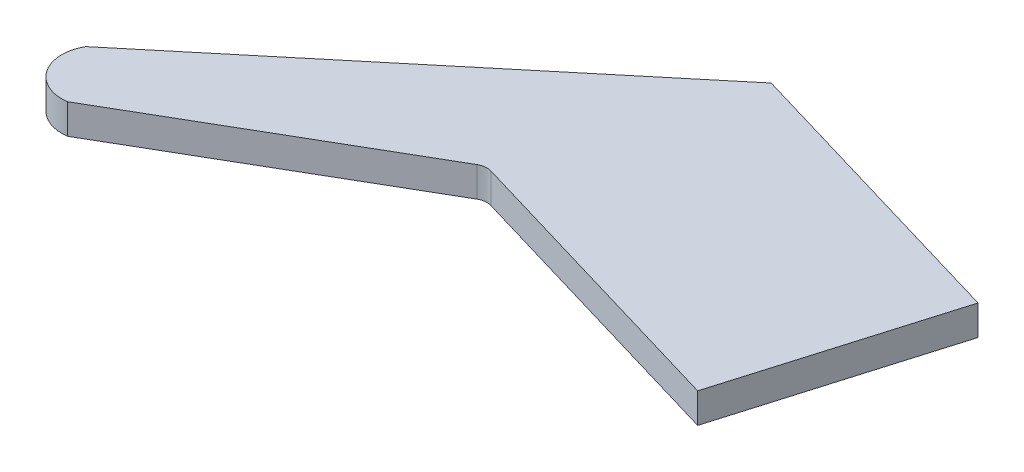
ISO-10303-21;
HEADER;
FILE_DESCRIPTION(('STEP AP214'),'2;1');
FILE_NAME('part.step','',(''),(''),'','','');
FILE_SCHEMA(('AUTOMOTIVE_DESIGN { 1 0 10303 214 1 1 1 1 }'));
ENDSEC;
DATA;
#1=APPLICATION_CONTEXT('core data for automotive mechanical design processes');
#2=APPLICATION_PROTOCOL_DEFINITION('international standard','automotive_design',2000,#1);
#3=PRODUCT_CONTEXT('',#1,'mechanical');
#4=PRODUCT('Part','Part','',(#3));
#5=PRODUCT_RELATED_PRODUCT_CATEGORY('part','',(#4));
#6=PRODUCT_DEFINITION_FORMATION('','',#4);
#7=PRODUCT_DEFINITION_CONTEXT('part definition',#1,'design');
#8=PRODUCT_DEFINITION('design','',#6,#7);
#9=PRODUCT_DEFINITION_SHAPE('','',#8);
#10=(LENGTH_UNIT() NAMED_UNIT(*) SI_UNIT(.MILLI.,.METRE.));
#11=(NAMED_UNIT(*) PLANE_ANGLE_UNIT() SI_UNIT($,.RADIAN.));
#12=(NAMED_UNIT(*) SI_UNIT($,.STERADIAN.) SOLID_ANGLE_UNIT());
#13=UNCERTAINTY_MEASURE_WITH_UNIT(LENGTH_MEASURE(1.E-05),#10,'distance_accuracy_value','');
#14=(GEOMETRIC_REPRESENTATION_CONTEXT(3) GLOBAL_UNCERTAINTY_ASSIGNED_CONTEXT((#13)) GLOBAL_UNIT_ASSIGNED_CONTEXT((#10,
#11,#12)) REPRESENTATION_CONTEXT('',''));
#15=CARTESIAN_POINT('',(0.,0.,0.));
#16=DIRECTION('',(0.,0.,1.));
#17=DIRECTION('',(1.,0.,0.));
#18=AXIS2_PLACEMENT_3D('',#15,#16,#17);
#19=CARTESIAN_POINT('',(24.2687822482393,4.7625,33.7222913548281));
#20=DIRECTION('',(0.,-1.,0.));
#21=DIRECTION('',(0.,0.,-1.));
#22=AXIS2_PLACEMENT_3D('',#19,#20,#21);
#23=CYLINDRICAL_SURFACE('',#22,2.54);
#24=CARTESIAN_POINT('',(24.2687822482393,0.,33.7222913548281));
#25=DIRECTION('',(0.,-1.,0.));
#26=DIRECTION('',(0.,0.,-1.));
#27=AXIS2_PLACEMENT_3D('',#24,#25,#26);
#28=CIRCLE('',#27,2.54);
#29=CARTESIAN_POINT('',(22.9946247329012,0.,31.5249924161065));
#30=VERTEX_POINT('',#29);
#31=CARTESIAN_POINT('',(24.9901812237873,0.,31.2868892282629));
#32=VERTEX_POINT('',#31);
#33=EDGE_CURVE('E138',#30,#32,#28,.T.);
#34=ORIENTED_EDGE('',*,*,#33,.T.);
#35=DIRECTION('',(0.,-1.,0.));
#36=VECTOR('',#35,1.);
#37=CARTESIAN_POINT('',(24.9901812237873,4.7625,31.2868892282629));
#38=LINE('',#37,#36);
#39=CARTESIAN_POINT('',(24.9901812237873,4.7625,31.2868892282629));
#40=VERTEX_POINT('',#39);
#41=EDGE_CURVE('E11',#40,#32,#38,.T.);
#42=ORIENTED_EDGE('',*,*,#41,.F.);
#43=CARTESIAN_POINT('',(24.2687822482393,4.7625,33.7222913548281));
#44=DIRECTION('',(0.,-1.,0.));
#45=DIRECTION('',(0.,0.,-1.));
#46=AXIS2_PLACEMENT_3D('',#43,#44,#45);
#47=CIRCLE('',#46,2.54);
#48=CARTESIAN_POINT('',(22.9946247329012,4.7625,31.5249924161065));
#49=VERTEX_POINT('',#48);
#50=EDGE_CURVE('E157',#49,#40,#47,.T.);
#51=ORIENTED_EDGE('',*,*,#50,.F.);
#52=DIRECTION('',(0.,-1.,0.));
#53=VECTOR('',#52,1.);
#54=CARTESIAN_POINT('',(22.9946247329012,4.7625,31.5249924161065));
#55=LINE('',#54,#53);
#56=EDGE_CURVE('E134',#49,#30,#55,.T.);
#57=ORIENTED_EDGE('',*,*,#56,.T.);
#58=EDGE_LOOP('',(#34,#42,#51,#57));
#59=FACE_BOUND('',#58,.T.);
#60=ADVANCED_FACE('F43',(#59),#23,.F.);
#61=CARTESIAN_POINT('',(71.7331323202995,4.7625,45.1327821374025));
#62=DIRECTION('',(0.284015344703924,0.,-0.958819734868193));
#63=DIRECTION('',(-0.958819734868193,0.,-0.284015344703924));
#64=AXIS2_PLACEMENT_3D('',#61,#62,#63);
#65=PLANE('',#64);
#66=DIRECTION('',(0.958819734868193,0.,0.284015344703924));
#67=VECTOR('',#66,1.);
#68=CARTESIAN_POINT('',(71.7331323202995,0.,45.1327821374025));
#69=LINE('',#68,#67);
#70=CARTESIAN_POINT('',(71.7331323202995,0.,45.1327821374025));
#71=VERTEX_POINT('',#70);
#72=EDGE_CURVE('E142',#32,#71,#69,.T.);
#73=ORIENTED_EDGE('',*,*,#72,.T.);
#74=DIRECTION('',(0.,-1.,0.));
#75=VECTOR('',#74,1.);
#76=CARTESIAN_POINT('',(71.7331323202995,4.7625,45.1327821374025));
#77=LINE('',#76,#75);
#78=CARTESIAN_POINT('',(71.7331323202995,4.7625,45.1327821374025));
#79=VERTEX_POINT('',#78);
#80=EDGE_CURVE('E52',#79,#71,#77,.T.);
#81=ORIENTED_EDGE('',*,*,#80,.F.);
#82=DIRECTION('',(0.958819734868193,0.,0.284015344703924));
#83=VECTOR('',#82,1.);
#84=CARTESIAN_POINT('',(71.7331323202995,4.7625,45.1327821374025));
#85=LINE('',#84,#83);
#86=EDGE_CURVE('E100',#40,#79,#85,.T.);
#87=ORIENTED_EDGE('',*,*,#86,.F.);
#88=ORIENTED_EDGE('',*,*,#41,.T.);
#89=EDGE_LOOP('',(#73,#81,#87,#88));
#90=FACE_BOUND('',#89,.T.);
#91=ADVANCED_FACE('F191',(#90),#65,.F.);
#92=CARTESIAN_POINT('',(81.9228928499145,4.7625,10.7327270996689));
#93=DIRECTION('',(-0.958819734868193,0.,-0.284015344703923));
#94=DIRECTION('',(-0.284015344703923,0.,0.958819734868193));
#95=AXIS2_PLACEMENT_3D('',#92,#93,#94);
#96=PLANE('',#95);
#97=DIRECTION('',(0.284015344703923,0.,-0.958819734868193));
#98=VECTOR('',#97,1.);
#99=CARTESIAN_POINT('',(81.9228928499145,0.,10.7327270996689));
#100=LINE('',#99,#98);
#101=CARTESIAN_POINT('',(81.9228928499145,0.,10.7327270996689));
#102=VERTEX_POINT('',#101);
#103=EDGE_CURVE('E145',#71,#102,#100,.T.);
#104=ORIENTED_EDGE('',*,*,#103,.T.);
#105=DIRECTION('',(0.,-1.,0.));
#106=VECTOR('',#105,1.);
#107=CARTESIAN_POINT('',(81.9228928499145,4.7625,10.7327270996689));
#108=LINE('',#107,#106);
#109=CARTESIAN_POINT('',(81.9228928499145,4.7625,10.7327270996689));
#110=VERTEX_POINT('',#109);
#111=EDGE_CURVE('E164',#110,#102,#108,.T.);
#112=ORIENTED_EDGE('',*,*,#111,.F.);
#113=DIRECTION('',(0.284015344703923,0.,-0.958819734868193));
#114=VECTOR('',#113,1.);
#115=CARTESIAN_POINT('',(81.9228928499145,4.7625,10.7327270996689));
#116=LINE('',#115,#114);
#117=EDGE_CURVE('E174',#79,#110,#116,.T.);
#118=ORIENTED_EDGE('',*,*,#117,.F.);
#119=ORIENTED_EDGE('',*,*,#80,.T.);
#120=EDGE_LOOP('',(#104,#112,#118,#119));
#121=FACE_BOUND('',#120,.T.);
#122=ADVANCED_FACE('F172',(#121),#96,.F.);
#123=CARTESIAN_POINT('',(81.9228928499145,4.7625,10.7327270996689));
#124=DIRECTION('',(-0.284015344703924,0.,0.958819734868193));
#125=DIRECTION('',(0.958819734868193,0.,0.284015344703924));
#126=AXIS2_PLACEMENT_3D('',#123,#124,#125);
#127=PLANE('',#126);
#128=DIRECTION('',(-0.958819734868193,0.,-0.284015344703924));
#129=VECTOR('',#128,1.);
#130=CARTESIAN_POINT('',(81.9228928499145,0.,10.7327270996689));
#131=LINE('',#130,#129);
#132=CARTESIAN_POINT('',(35.1799417534023,0.,-3.11316580947066));
#133=VERTEX_POINT('',#132);
#134=EDGE_CURVE('E148',#102,#133,#131,.T.);
#135=ORIENTED_EDGE('',*,*,#134,.T.);
#136=DIRECTION('',(0.,-1.,0.));
#137=VECTOR('',#136,1.);
#138=CARTESIAN_POINT('',(35.1799417534023,4.7625,-3.11316580947066));
#139=LINE('',#138,#137);
#140=CARTESIAN_POINT('',(35.1799417534023,4.7625,-3.11316580947066));
#141=VERTEX_POINT('',#140);
#142=EDGE_CURVE('E127',#141,#133,#139,.T.);
#143=ORIENTED_EDGE('',*,*,#142,.F.);
#144=DIRECTION('',(-0.958819734868193,0.,-0.284015344703924));
#145=VECTOR('',#144,1.);
#146=CARTESIAN_POINT('',(81.9228928499145,4.7625,10.7327270996689));
#147=LINE('',#146,#145);
#148=EDGE_CURVE('E116',#110,#141,#147,.T.);
#149=ORIENTED_EDGE('',*,*,#148,.F.);
#150=ORIENTED_EDGE('',*,*,#111,.T.);
#151=EDGE_LOOP('',(#135,#143,#149,#150));
#152=FACE_BOUND('',#151,.T.);
#153=ADVANCED_FACE('F180',(#152),#127,.F.);
#154=CARTESIAN_POINT('',(35.1799417534023,4.7625,-3.11316580947066));
#155=DIRECTION('',(0.639283715997344,0.,0.768970955537742));
#156=DIRECTION('',(0.768970955537742,0.,-0.639283715997343));
#157=AXIS2_PLACEMENT_3D('',#154,#155,#156);
#158=PLANE('',#157);
#159=DIRECTION('',(-0.768970955537742,0.,0.639283715997343));
#160=VECTOR('',#159,1.);
#161=CARTESIAN_POINT('',(35.1799417534023,0.,-3.11316580947066));
#162=LINE('',#161,#160);
#163=CARTESIAN_POINT('',(-24.3515697934004,0.,46.3783340274317));
#164=VERTEX_POINT('',#163);
#165=EDGE_CURVE('E125',#133,#164,#162,.T.);
#166=ORIENTED_EDGE('',*,*,#165,.T.);
#167=DIRECTION('',(0.,-1.,0.));
#168=VECTOR('',#167,1.);
#169=CARTESIAN_POINT('',(-24.3515697934004,4.7625,46.3783340274317));
#170=LINE('',#169,#168);
#171=CARTESIAN_POINT('',(-24.3515697934004,4.7625,46.3783340274317));
#172=VERTEX_POINT('',#171);
#173=EDGE_CURVE('E122',#172,#164,#170,.T.);
#174=ORIENTED_EDGE('',*,*,#173,.F.);
#175=DIRECTION('',(-0.768970955537742,0.,0.639283715997343));
#176=VECTOR('',#175,1.);
#177=CARTESIAN_POINT('',(35.1799417534023,4.7625,-3.11316580947066));
#178=LINE('',#177,#176);
#179=EDGE_CURVE('E110',#141,#172,#178,.T.);
#180=ORIENTED_EDGE('',*,*,#179,.F.);
#181=ORIENTED_EDGE('',*,*,#142,.T.);
#182=EDGE_LOOP('',(#166,#174,#180,#181));
#183=FACE_BOUND('',#182,.T.);
#184=ADVANCED_FACE('F123',(#183),#158,.F.);
#185=CARTESIAN_POINT('',(-19.0749533270543,4.7625,49.398325235588));
#186=DIRECTION('',(0.,-1.,0.));
#187=DIRECTION('',(0.,0.,-1.));
#188=AXIS2_PLACEMENT_3D('',#185,#186,#187);
#189=CYLINDRICAL_SURFACE('',#188,6.07972270998076);
#190=CARTESIAN_POINT('',(-19.0749533270543,0.,49.398325235588));
#191=DIRECTION('',(0.,1.,0.));
#192=DIRECTION('',(0.,0.,-1.));
#193=AXIS2_PLACEMENT_3D('',#190,#191,#192);
#194=CIRCLE('',#193,6.07972270998076);
#195=CARTESIAN_POINT('',(-18.2047303681297,0.,55.415445828697));
#196=VERTEX_POINT('',#195);
#197=EDGE_CURVE('E86',#164,#196,#194,.T.);
#198=ORIENTED_EDGE('',*,*,#197,.T.);
#199=DIRECTION('',(0.,-1.,0.));
#200=VECTOR('',#199,1.);
#201=CARTESIAN_POINT('',(-18.2047303681297,4.7625,55.415445828697));
#202=LINE('',#201,#200);
#203=CARTESIAN_POINT('',(-18.2047303681297,4.7625,55.415445828697));
#204=VERTEX_POINT('',#203);
#205=EDGE_CURVE('E128',#204,#196,#202,.T.);
#206=ORIENTED_EDGE('',*,*,#205,.F.);
#207=CARTESIAN_POINT('',(-19.0749533270543,4.7625,49.398325235588));
#208=DIRECTION('',(0.,1.,0.));
#209=DIRECTION('',(0.,0.,-1.));
#210=AXIS2_PLACEMENT_3D('',#207,#208,#209);
#211=CIRCLE('',#210,6.07972270998076);
#212=EDGE_CURVE('E114',#172,#204,#211,.T.);
#213=ORIENTED_EDGE('',*,*,#212,.F.);
#214=ORIENTED_EDGE('',*,*,#173,.T.);
#215=EDGE_LOOP('',(#198,#206,#213,#214));
#216=FACE_BOUND('',#215,.T.);
#217=ADVANCED_FACE('F130',(#216),#189,.T.);
#218=CARTESIAN_POINT('',(22.9946247329012,4.7625,31.5249924161065));
#219=DIRECTION('',(-0.501636817062268,0.,-0.865078322331358));
#220=DIRECTION('',(-0.865078322331358,0.,0.501636817062268));
#221=AXIS2_PLACEMENT_3D('',#218,#219,#220);
#222=PLANE('',#221);
#223=DIRECTION('',(0.865078322331358,0.,-0.501636817062268));
#224=VECTOR('',#223,1.);
#225=CARTESIAN_POINT('',(22.9946247329012,0.,31.5249924161065));
#226=LINE('',#225,#224);
#227=EDGE_CURVE('E92',#196,#30,#226,.T.);
#228=ORIENTED_EDGE('',*,*,#227,.T.);
#229=ORIENTED_EDGE('',*,*,#56,.F.);
#230=DIRECTION('',(0.865078322331358,0.,-0.501636817062268));
#231=VECTOR('',#230,1.);
#232=CARTESIAN_POINT('',(22.9946247329012,4.7625,31.5249924161065));
#233=LINE('',#232,#231);
#234=EDGE_CURVE('E60',#204,#49,#233,.T.);
#235=ORIENTED_EDGE('',*,*,#234,.F.);
#236=ORIENTED_EDGE('',*,*,#205,.T.);
#237=EDGE_LOOP('',(#228,#229,#235,#236));
#238=FACE_BOUND('',#237,.T.);
#239=ADVANCED_FACE('F205',(#238),#222,.F.);
#240=CARTESIAN_POINT('',(24.2687822482393,4.7625,33.7222913548281));
#241=DIRECTION('',(0.,-1.,0.));
#242=DIRECTION('',(0.,0.,-1.));
#243=AXIS2_PLACEMENT_3D('',#240,#241,#242);
#244=PLANE('',#243);
#245=ORIENTED_EDGE('',*,*,#50,.T.);
#246=ORIENTED_EDGE('',*,*,#86,.T.);
#247=ORIENTED_EDGE('',*,*,#117,.T.);
#248=ORIENTED_EDGE('',*,*,#148,.T.);
#249=ORIENTED_EDGE('',*,*,#179,.T.);
#250=ORIENTED_EDGE('',*,*,#212,.T.);
#251=ORIENTED_EDGE('',*,*,#234,.T.);
#252=EDGE_LOOP('',(#245,#246,#247,#248,#249,#250,#251));
#253=FACE_BOUND('',#252,.T.);
#254=ADVANCED_FACE('F112',(#253),#244,.F.);
#255=CARTESIAN_POINT('',(24.2687822482393,0.,33.7222913548281));
#256=DIRECTION('',(0.,-1.,0.));
#257=DIRECTION('',(0.,0.,-1.));
#258=AXIS2_PLACEMENT_3D('',#255,#256,#257);
#259=PLANE('',#258);
#260=ORIENTED_EDGE('',*,*,#33,.F.);
#261=ORIENTED_EDGE('',*,*,#227,.F.);
#262=ORIENTED_EDGE('',*,*,#197,.F.);
#263=ORIENTED_EDGE('',*,*,#165,.F.);
#264=ORIENTED_EDGE('',*,*,#134,.F.);
#265=ORIENTED_EDGE('',*,*,#103,.F.);
#266=ORIENTED_EDGE('',*,*,#72,.F.);
#267=EDGE_LOOP('',(#260,#261,#262,#263,#264,#265,#266));
#268=FACE_BOUND('',#267,.T.);
#269=ADVANCED_FACE('F178',(#268),#259,.T.);
#270=CLOSED_SHELL('',(#60,#91,#122,#153,#184,#217,#239,#254,#269));
#271=MANIFOLD_SOLID_BREP('B2',#270);
#272=ADVANCED_BREP_SHAPE_REPRESENTATION('',(#18,#271),#14);
#273=SHAPE_DEFINITION_REPRESENTATION(#9,#272);
ENDSEC;
END-ISO-10303-21;
